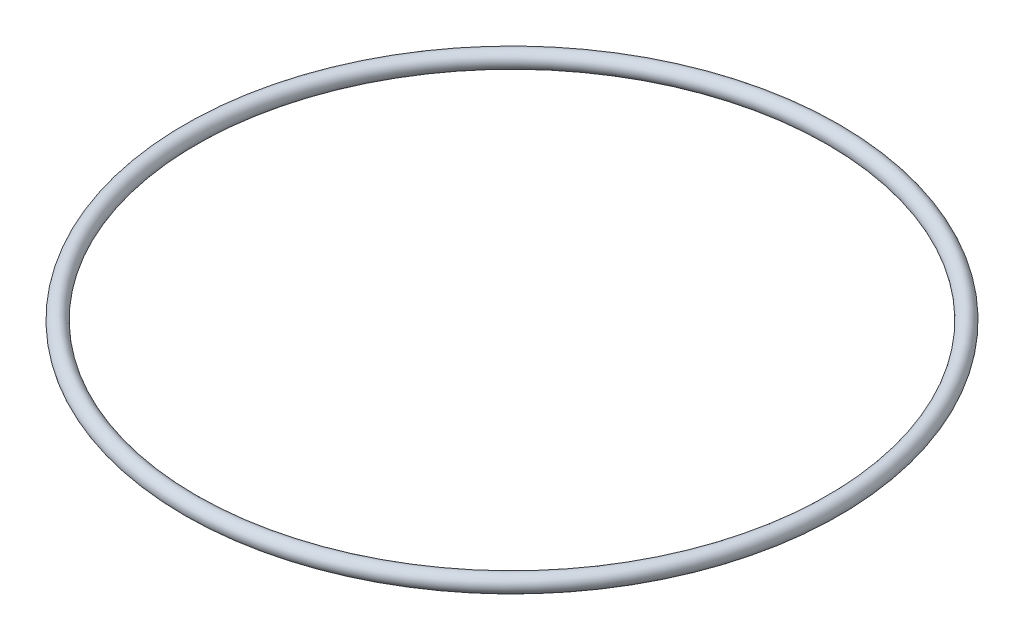
ISO-10303-21;
HEADER;
FILE_DESCRIPTION(('STEP AP214'),'2;1');
FILE_NAME('part.step','',(''),(''),'','','');
FILE_SCHEMA(('AUTOMOTIVE_DESIGN { 1 0 10303 214 1 1 1 1 }'));
ENDSEC;
DATA;
#1=APPLICATION_CONTEXT('core data for automotive mechanical design processes');
#2=APPLICATION_PROTOCOL_DEFINITION('international standard','automotive_design',2000,#1);
#3=PRODUCT_CONTEXT('',#1,'mechanical');
#4=PRODUCT('Part','Part','',(#3));
#5=PRODUCT_RELATED_PRODUCT_CATEGORY('part','',(#4));
#6=PRODUCT_DEFINITION_FORMATION('','',#4);
#7=PRODUCT_DEFINITION_CONTEXT('part definition',#1,'design');
#8=PRODUCT_DEFINITION('design','',#6,#7);
#9=PRODUCT_DEFINITION_SHAPE('','',#8);
#10=(LENGTH_UNIT() NAMED_UNIT(*) SI_UNIT(.MILLI.,.METRE.));
#11=(NAMED_UNIT(*) PLANE_ANGLE_UNIT() SI_UNIT($,.RADIAN.));
#12=(NAMED_UNIT(*) SI_UNIT($,.STERADIAN.) SOLID_ANGLE_UNIT());
#13=UNCERTAINTY_MEASURE_WITH_UNIT(LENGTH_MEASURE(1.E-05),#10,'distance_accuracy_value','');
#14=(GEOMETRIC_REPRESENTATION_CONTEXT(3) GLOBAL_UNCERTAINTY_ASSIGNED_CONTEXT((#13)) GLOBAL_UNIT_ASSIGNED_CONTEXT((#10,
#11,#12)) REPRESENTATION_CONTEXT('',''));
#15=CARTESIAN_POINT('',(0.,0.,0.));
#16=DIRECTION('',(0.,0.,1.));
#17=DIRECTION('',(1.,0.,0.));
#18=AXIS2_PLACEMENT_3D('',#15,#16,#17);
#19=CARTESIAN_POINT('',(0.,0.,0.));
#20=DIRECTION('',(0.,-1.,0.));
#21=DIRECTION('',(0.,0.,-1.));
#22=AXIS2_PLACEMENT_3D('',#19,#20,#21);
#23=TOROIDAL_SURFACE('',#22,48.87,1.25);
#24=CARTESIAN_POINT('',(0.,0.,-50.12));
#25=VERTEX_POINT('',#24);
#26=VERTEX_LOOP('',#25);
#27=FACE_BOUND('',#26,.T.);
#28=ADVANCED_FACE('F32',(#27),#23,.T.);
#29=CLOSED_SHELL('',(#28));
#30=MANIFOLD_SOLID_BREP('B2',#29);
#31=ADVANCED_BREP_SHAPE_REPRESENTATION('',(#18,#30),#14);
#32=SHAPE_DEFINITION_REPRESENTATION(#9,#31);
ENDSEC;
END-ISO-10303-21;
